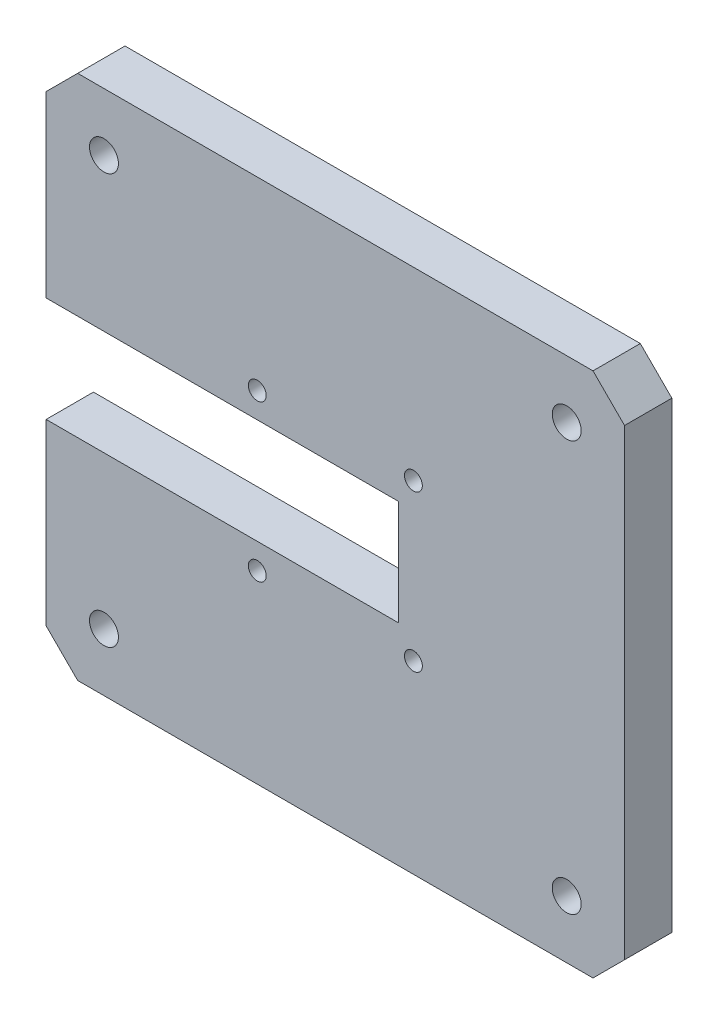
ISO-10303-21;
HEADER;
FILE_DESCRIPTION(('STEP AP214'),'2;1');
FILE_NAME('part.step','',(''),(''),'','','');
FILE_SCHEMA(('AUTOMOTIVE_DESIGN { 1 0 10303 214 1 1 1 1 }'));
ENDSEC;
DATA;
#1=APPLICATION_CONTEXT('core data for automotive mechanical design processes');
#2=APPLICATION_PROTOCOL_DEFINITION('international standard','automotive_design',2000,#1);
#3=PRODUCT_CONTEXT('',#1,'mechanical');
#4=PRODUCT('Part','Part','',(#3));
#5=PRODUCT_RELATED_PRODUCT_CATEGORY('part','',(#4));
#6=PRODUCT_DEFINITION_FORMATION('','',#4);
#7=PRODUCT_DEFINITION_CONTEXT('part definition',#1,'design');
#8=PRODUCT_DEFINITION('design','',#6,#7);
#9=PRODUCT_DEFINITION_SHAPE('','',#8);
#10=(LENGTH_UNIT() NAMED_UNIT(*) SI_UNIT(.MILLI.,.METRE.));
#11=(NAMED_UNIT(*) PLANE_ANGLE_UNIT() SI_UNIT($,.RADIAN.));
#12=(NAMED_UNIT(*) SI_UNIT($,.STERADIAN.) SOLID_ANGLE_UNIT());
#13=UNCERTAINTY_MEASURE_WITH_UNIT(LENGTH_MEASURE(1.E-05),#10,'distance_accuracy_value','');
#14=(GEOMETRIC_REPRESENTATION_CONTEXT(3) GLOBAL_UNCERTAINTY_ASSIGNED_CONTEXT((#13)) GLOBAL_UNIT_ASSIGNED_CONTEXT((#10,
#11,#12)) REPRESENTATION_CONTEXT('',''));
#15=CARTESIAN_POINT('',(0.,0.,0.));
#16=DIRECTION('',(0.,0.,1.));
#17=DIRECTION('',(1.,0.,0.));
#18=AXIS2_PLACEMENT_3D('',#15,#16,#17);
#19=CARTESIAN_POINT('',(0.,0.,0.));
#20=DIRECTION('',(0.,0.,1.));
#21=DIRECTION('',(1.,0.,0.));
#22=AXIS2_PLACEMENT_3D('',#19,#20,#21);
#23=PLANE('',#22);
#24=DIRECTION('',(0.,-1.,0.));
#25=VECTOR('',#24,1.);
#26=CARTESIAN_POINT('',(-55.,-10.,0.));
#27=LINE('',#26,#25);
#28=CARTESIAN_POINT('',(-55.,-10.,0.));
#29=VERTEX_POINT('',#28);
#30=CARTESIAN_POINT('',(-55.,-44.,0.));
#31=VERTEX_POINT('',#30);
#32=EDGE_CURVE('E131',#29,#31,#27,.T.);
#33=ORIENTED_EDGE('',*,*,#32,.F.);
#34=DIRECTION('',(-1.,0.,0.));
#35=VECTOR('',#34,1.);
#36=CARTESIAN_POINT('',(12.,-10.,0.));
#37=LINE('',#36,#35);
#38=CARTESIAN_POINT('',(12.,-10.,0.));
#39=VERTEX_POINT('',#38);
#40=EDGE_CURVE('E52',#39,#29,#37,.T.);
#41=ORIENTED_EDGE('',*,*,#40,.F.);
#42=DIRECTION('',(0.,-1.,0.));
#43=VECTOR('',#42,1.);
#44=CARTESIAN_POINT('',(12.,10.,0.));
#45=LINE('',#44,#43);
#46=CARTESIAN_POINT('',(12.,10.,0.));
#47=VERTEX_POINT('',#46);
#48=EDGE_CURVE('E60',#47,#39,#45,.T.);
#49=ORIENTED_EDGE('',*,*,#48,.F.);
#50=DIRECTION('',(1.,0.,0.));
#51=VECTOR('',#50,1.);
#52=CARTESIAN_POINT('',(-55.,10.,0.));
#53=LINE('',#52,#51);
#54=CARTESIAN_POINT('',(-55.,10.,0.));
#55=VERTEX_POINT('',#54);
#56=EDGE_CURVE('E233',#55,#47,#53,.T.);
#57=ORIENTED_EDGE('',*,*,#56,.F.);
#58=DIRECTION('',(0.,-1.,0.));
#59=VECTOR('',#58,1.);
#60=CARTESIAN_POINT('',(-55.,44.,0.));
#61=LINE('',#60,#59);
#62=CARTESIAN_POINT('',(-55.,44.,0.));
#63=VERTEX_POINT('',#62);
#64=EDGE_CURVE('E231',#63,#55,#61,.T.);
#65=ORIENTED_EDGE('',*,*,#64,.F.);
#66=DIRECTION('',(-0.707106781186547,-0.707106781186548,0.));
#67=VECTOR('',#66,1.);
#68=CARTESIAN_POINT('',(-49.,50.,0.));
#69=LINE('',#68,#67);
#70=CARTESIAN_POINT('',(-49.,50.,0.));
#71=VERTEX_POINT('',#70);
#72=EDGE_CURVE('E229',#71,#63,#69,.T.);
#73=ORIENTED_EDGE('',*,*,#72,.F.);
#74=DIRECTION('',(-1.,0.,0.));
#75=VECTOR('',#74,1.);
#76=CARTESIAN_POINT('',(49.,50.,0.));
#77=LINE('',#76,#75);
#78=CARTESIAN_POINT('',(49.,50.,0.));
#79=VERTEX_POINT('',#78);
#80=EDGE_CURVE('E227',#79,#71,#77,.T.);
#81=ORIENTED_EDGE('',*,*,#80,.F.);
#82=DIRECTION('',(-0.707106781186547,0.707106781186548,0.));
#83=VECTOR('',#82,1.);
#84=CARTESIAN_POINT('',(55.,44.,0.));
#85=LINE('',#84,#83);
#86=CARTESIAN_POINT('',(55.,44.,0.));
#87=VERTEX_POINT('',#86);
#88=EDGE_CURVE('E225',#87,#79,#85,.T.);
#89=ORIENTED_EDGE('',*,*,#88,.F.);
#90=DIRECTION('',(0.,1.,0.));
#91=VECTOR('',#90,1.);
#92=CARTESIAN_POINT('',(55.,-44.,0.));
#93=LINE('',#92,#91);
#94=CARTESIAN_POINT('',(55.,-44.,0.));
#95=VERTEX_POINT('',#94);
#96=EDGE_CURVE('E223',#95,#87,#93,.T.);
#97=ORIENTED_EDGE('',*,*,#96,.F.);
#98=DIRECTION('',(0.707106781186547,0.707106781186548,0.));
#99=VECTOR('',#98,1.);
#100=CARTESIAN_POINT('',(49.,-50.,0.));
#101=LINE('',#100,#99);
#102=CARTESIAN_POINT('',(49.,-50.,0.));
#103=VERTEX_POINT('',#102);
#104=EDGE_CURVE('E221',#103,#95,#101,.T.);
#105=ORIENTED_EDGE('',*,*,#104,.F.);
#106=DIRECTION('',(1.,0.,0.));
#107=VECTOR('',#106,1.);
#108=CARTESIAN_POINT('',(-49.,-50.,0.));
#109=LINE('',#108,#107);
#110=CARTESIAN_POINT('',(-49.,-50.,0.));
#111=VERTEX_POINT('',#110);
#112=EDGE_CURVE('E219',#111,#103,#109,.T.);
#113=ORIENTED_EDGE('',*,*,#112,.F.);
#114=DIRECTION('',(0.707106781186547,-0.707106781186548,0.));
#115=VECTOR('',#114,1.);
#116=CARTESIAN_POINT('',(-55.,-44.,0.));
#117=LINE('',#116,#115);
#118=EDGE_CURVE('E217',#31,#111,#117,.T.);
#119=ORIENTED_EDGE('',*,*,#118,.F.);
#120=EDGE_LOOP('',(#33,#41,#49,#57,#65,#73,#81,#89,#97,#105,#113,#119));
#121=FACE_BOUND('',#120,.T.);
#122=CARTESIAN_POINT('',(-14.845,-14.845,0.));
#123=DIRECTION('',(0.,0.,1.));
#124=DIRECTION('',(1.,0.,0.));
#125=AXIS2_PLACEMENT_3D('',#122,#123,#124);
#126=CIRCLE('',#125,3.75);
#127=CARTESIAN_POINT('',(-11.095,-14.845,0.));
#128=VERTEX_POINT('',#127);
#129=EDGE_CURVE('E211',#128,#128,#126,.T.);
#130=ORIENTED_EDGE('',*,*,#129,.T.);
#131=EDGE_LOOP('',(#130));
#132=FACE_BOUND('',#131,.T.);
#133=CARTESIAN_POINT('',(-14.845,14.845,0.));
#134=DIRECTION('',(0.,0.,1.));
#135=DIRECTION('',(1.,0.,0.));
#136=AXIS2_PLACEMENT_3D('',#133,#134,#135);
#137=CIRCLE('',#136,3.75);
#138=CARTESIAN_POINT('',(-11.095,14.845,0.));
#139=VERTEX_POINT('',#138);
#140=EDGE_CURVE('E206',#139,#139,#137,.T.);
#141=ORIENTED_EDGE('',*,*,#140,.T.);
#142=EDGE_LOOP('',(#141));
#143=FACE_BOUND('',#142,.T.);
#144=CARTESIAN_POINT('',(14.845,-14.845,0.));
#145=DIRECTION('',(0.,0.,1.));
#146=DIRECTION('',(1.,0.,0.));
#147=AXIS2_PLACEMENT_3D('',#144,#145,#146);
#148=CIRCLE('',#147,3.75);
#149=CARTESIAN_POINT('',(18.595,-14.845,0.));
#150=VERTEX_POINT('',#149);
#151=EDGE_CURVE('E200',#150,#150,#148,.T.);
#152=ORIENTED_EDGE('',*,*,#151,.T.);
#153=EDGE_LOOP('',(#152));
#154=FACE_BOUND('',#153,.T.);
#155=CARTESIAN_POINT('',(14.845,14.845,0.));
#156=DIRECTION('',(0.,0.,1.));
#157=DIRECTION('',(1.,0.,0.));
#158=AXIS2_PLACEMENT_3D('',#155,#156,#157);
#159=CIRCLE('',#158,3.75);
#160=CARTESIAN_POINT('',(18.595,14.845,0.));
#161=VERTEX_POINT('',#160);
#162=EDGE_CURVE('E194',#161,#161,#159,.T.);
#163=ORIENTED_EDGE('',*,*,#162,.T.);
#164=EDGE_LOOP('',(#163));
#165=FACE_BOUND('',#164,.T.);
#166=CARTESIAN_POINT('',(-44.,-39.,0.));
#167=DIRECTION('',(0.,0.,1.));
#168=DIRECTION('',(1.,0.,0.));
#169=AXIS2_PLACEMENT_3D('',#166,#167,#168);
#170=CIRCLE('',#169,2.75);
#171=CARTESIAN_POINT('',(-41.25,-39.,0.));
#172=VERTEX_POINT('',#171);
#173=EDGE_CURVE('E191',#172,#172,#170,.T.);
#174=ORIENTED_EDGE('',*,*,#173,.T.);
#175=EDGE_LOOP('',(#174));
#176=FACE_BOUND('',#175,.T.);
#177=CARTESIAN_POINT('',(-44.,39.,0.));
#178=DIRECTION('',(0.,0.,1.));
#179=DIRECTION('',(1.,0.,0.));
#180=AXIS2_PLACEMENT_3D('',#177,#178,#179);
#181=CIRCLE('',#180,2.75);
#182=CARTESIAN_POINT('',(-41.25,39.,0.));
#183=VERTEX_POINT('',#182);
#184=EDGE_CURVE('E188',#183,#183,#181,.T.);
#185=ORIENTED_EDGE('',*,*,#184,.T.);
#186=EDGE_LOOP('',(#185));
#187=FACE_BOUND('',#186,.T.);
#188=CARTESIAN_POINT('',(44.,-39.,0.));
#189=DIRECTION('',(0.,0.,1.));
#190=DIRECTION('',(1.,0.,0.));
#191=AXIS2_PLACEMENT_3D('',#188,#189,#190);
#192=CIRCLE('',#191,2.75);
#193=CARTESIAN_POINT('',(46.75,-39.,0.));
#194=VERTEX_POINT('',#193);
#195=EDGE_CURVE('E184',#194,#194,#192,.T.);
#196=ORIENTED_EDGE('',*,*,#195,.T.);
#197=EDGE_LOOP('',(#196));
#198=FACE_BOUND('',#197,.T.);
#199=CARTESIAN_POINT('',(44.,39.,0.));
#200=DIRECTION('',(0.,0.,1.));
#201=DIRECTION('',(1.,0.,0.));
#202=AXIS2_PLACEMENT_3D('',#199,#200,#201);
#203=CIRCLE('',#202,2.75);
#204=CARTESIAN_POINT('',(46.75,39.,0.));
#205=VERTEX_POINT('',#204);
#206=EDGE_CURVE('E181',#205,#205,#203,.T.);
#207=ORIENTED_EDGE('',*,*,#206,.T.);
#208=EDGE_LOOP('',(#207));
#209=FACE_BOUND('',#208,.T.);
#210=ADVANCED_FACE('F37',(#121,#132,#143,#154,#165,#176,#187,#198,#209),#23,.F.);
#211=CARTESIAN_POINT('',(-55.,-10.,4.));
#212=DIRECTION('',(1.,0.,0.));
#213=DIRECTION('',(0.,0.,-1.));
#214=AXIS2_PLACEMENT_3D('',#211,#212,#213);
#215=PLANE('',#214);
#216=ORIENTED_EDGE('',*,*,#32,.T.);
#217=DIRECTION('',(0.,0.,-1.));
#218=VECTOR('',#217,1.);
#219=CARTESIAN_POINT('',(-55.,-44.,4.));
#220=LINE('',#219,#218);
#221=CARTESIAN_POINT('',(-55.,-44.,9.));
#222=VERTEX_POINT('',#221);
#223=EDGE_CURVE('E11',#222,#31,#220,.T.);
#224=ORIENTED_EDGE('',*,*,#223,.F.);
#225=DIRECTION('',(0.,-1.,0.));
#226=VECTOR('',#225,1.);
#227=CARTESIAN_POINT('',(-55.,-10.,9.));
#228=LINE('',#227,#226);
#229=CARTESIAN_POINT('',(-55.,-10.,9.));
#230=VERTEX_POINT('',#229);
#231=EDGE_CURVE('E129',#230,#222,#228,.T.);
#232=ORIENTED_EDGE('',*,*,#231,.F.);
#233=DIRECTION('',(0.,0.,-1.));
#234=VECTOR('',#233,1.);
#235=CARTESIAN_POINT('',(-55.,-10.,4.));
#236=LINE('',#235,#234);
#237=EDGE_CURVE('E237',#230,#29,#236,.T.);
#238=ORIENTED_EDGE('',*,*,#237,.T.);
#239=EDGE_LOOP('',(#216,#224,#232,#238));
#240=FACE_BOUND('',#239,.T.);
#241=ADVANCED_FACE('F39',(#240),#215,.F.);
#242=CARTESIAN_POINT('',(-55.,-44.,4.));
#243=DIRECTION('',(0.707106781186548,0.707106781186547,0.));
#244=DIRECTION('',(-0.707106781186547,0.707106781186548,0.));
#245=AXIS2_PLACEMENT_3D('',#242,#243,#244);
#246=PLANE('',#245);
#247=ORIENTED_EDGE('',*,*,#118,.T.);
#248=DIRECTION('',(0.,0.,-1.));
#249=VECTOR('',#248,1.);
#250=CARTESIAN_POINT('',(-49.,-50.,4.));
#251=LINE('',#250,#249);
#252=CARTESIAN_POINT('',(-49.,-50.,9.));
#253=VERTEX_POINT('',#252);
#254=EDGE_CURVE('E45',#253,#111,#251,.T.);
#255=ORIENTED_EDGE('',*,*,#254,.F.);
#256=DIRECTION('',(0.707106781186547,-0.707106781186548,0.));
#257=VECTOR('',#256,1.);
#258=CARTESIAN_POINT('',(-55.,-44.,9.));
#259=LINE('',#258,#257);
#260=EDGE_CURVE('E134',#222,#253,#259,.T.);
#261=ORIENTED_EDGE('',*,*,#260,.F.);
#262=ORIENTED_EDGE('',*,*,#223,.T.);
#263=EDGE_LOOP('',(#247,#255,#261,#262));
#264=FACE_BOUND('',#263,.T.);
#265=ADVANCED_FACE('F135',(#264),#246,.F.);
#266=CARTESIAN_POINT('',(-49.,-50.,4.));
#267=DIRECTION('',(0.,1.,0.));
#268=DIRECTION('',(0.,0.,1.));
#269=AXIS2_PLACEMENT_3D('',#266,#267,#268);
#270=PLANE('',#269);
#271=ORIENTED_EDGE('',*,*,#112,.T.);
#272=DIRECTION('',(0.,0.,-1.));
#273=VECTOR('',#272,1.);
#274=CARTESIAN_POINT('',(49.,-50.,4.));
#275=LINE('',#274,#273);
#276=CARTESIAN_POINT('',(49.,-50.,9.));
#277=VERTEX_POINT('',#276);
#278=EDGE_CURVE('E261',#277,#103,#275,.T.);
#279=ORIENTED_EDGE('',*,*,#278,.F.);
#280=DIRECTION('',(1.,0.,0.));
#281=VECTOR('',#280,1.);
#282=CARTESIAN_POINT('',(-49.,-50.,9.));
#283=LINE('',#282,#281);
#284=EDGE_CURVE('E140',#253,#277,#283,.T.);
#285=ORIENTED_EDGE('',*,*,#284,.F.);
#286=ORIENTED_EDGE('',*,*,#254,.T.);
#287=EDGE_LOOP('',(#271,#279,#285,#286));
#288=FACE_BOUND('',#287,.T.);
#289=ADVANCED_FACE('F265',(#288),#270,.F.);
#290=CARTESIAN_POINT('',(49.,-50.,4.));
#291=DIRECTION('',(-0.707106781186548,0.707106781186547,0.));
#292=DIRECTION('',(-0.707106781186547,-0.707106781186548,0.));
#293=AXIS2_PLACEMENT_3D('',#290,#291,#292);
#294=PLANE('',#293);
#295=ORIENTED_EDGE('',*,*,#104,.T.);
#296=DIRECTION('',(0.,0.,-1.));
#297=VECTOR('',#296,1.);
#298=CARTESIAN_POINT('',(55.,-44.,4.));
#299=LINE('',#298,#297);
#300=CARTESIAN_POINT('',(55.,-44.,9.));
#301=VERTEX_POINT('',#300);
#302=EDGE_CURVE('E258',#301,#95,#299,.T.);
#303=ORIENTED_EDGE('',*,*,#302,.F.);
#304=DIRECTION('',(0.707106781186547,0.707106781186548,0.));
#305=VECTOR('',#304,1.);
#306=CARTESIAN_POINT('',(49.,-50.,9.));
#307=LINE('',#306,#305);
#308=EDGE_CURVE('E156',#277,#301,#307,.T.);
#309=ORIENTED_EDGE('',*,*,#308,.F.);
#310=ORIENTED_EDGE('',*,*,#278,.T.);
#311=EDGE_LOOP('',(#295,#303,#309,#310));
#312=FACE_BOUND('',#311,.T.);
#313=ADVANCED_FACE('F272',(#312),#294,.F.);
#314=CARTESIAN_POINT('',(55.,-44.,4.));
#315=DIRECTION('',(-1.,0.,0.));
#316=DIRECTION('',(0.,0.,1.));
#317=AXIS2_PLACEMENT_3D('',#314,#315,#316);
#318=PLANE('',#317);
#319=ORIENTED_EDGE('',*,*,#96,.T.);
#320=DIRECTION('',(0.,0.,-1.));
#321=VECTOR('',#320,1.);
#322=CARTESIAN_POINT('',(55.,44.,4.));
#323=LINE('',#322,#321);
#324=CARTESIAN_POINT('',(55.,44.,9.));
#325=VERTEX_POINT('',#324);
#326=EDGE_CURVE('E255',#325,#87,#323,.T.);
#327=ORIENTED_EDGE('',*,*,#326,.F.);
#328=DIRECTION('',(0.,1.,0.));
#329=VECTOR('',#328,1.);
#330=CARTESIAN_POINT('',(55.,-44.,9.));
#331=LINE('',#330,#329);
#332=EDGE_CURVE('E159',#301,#325,#331,.T.);
#333=ORIENTED_EDGE('',*,*,#332,.F.);
#334=ORIENTED_EDGE('',*,*,#302,.T.);
#335=EDGE_LOOP('',(#319,#327,#333,#334));
#336=FACE_BOUND('',#335,.T.);
#337=ADVANCED_FACE('F276',(#336),#318,.F.);
#338=CARTESIAN_POINT('',(55.,44.,4.));
#339=DIRECTION('',(-0.707106781186548,-0.707106781186547,0.));
#340=DIRECTION('',(0.707106781186547,-0.707106781186548,0.));
#341=AXIS2_PLACEMENT_3D('',#338,#339,#340);
#342=PLANE('',#341);
#343=ORIENTED_EDGE('',*,*,#88,.T.);
#344=DIRECTION('',(0.,0.,-1.));
#345=VECTOR('',#344,1.);
#346=CARTESIAN_POINT('',(49.,50.,4.));
#347=LINE('',#346,#345);
#348=CARTESIAN_POINT('',(49.,50.,9.));
#349=VERTEX_POINT('',#348);
#350=EDGE_CURVE('E252',#349,#79,#347,.T.);
#351=ORIENTED_EDGE('',*,*,#350,.F.);
#352=DIRECTION('',(-0.707106781186547,0.707106781186548,0.));
#353=VECTOR('',#352,1.);
#354=CARTESIAN_POINT('',(55.,44.,9.));
#355=LINE('',#354,#353);
#356=EDGE_CURVE('E162',#325,#349,#355,.T.);
#357=ORIENTED_EDGE('',*,*,#356,.F.);
#358=ORIENTED_EDGE('',*,*,#326,.T.);
#359=EDGE_LOOP('',(#343,#351,#357,#358));
#360=FACE_BOUND('',#359,.T.);
#361=ADVANCED_FACE('F280',(#360),#342,.F.);
#362=CARTESIAN_POINT('',(49.,50.,4.));
#363=DIRECTION('',(0.,-1.,0.));
#364=DIRECTION('',(0.,0.,-1.));
#365=AXIS2_PLACEMENT_3D('',#362,#363,#364);
#366=PLANE('',#365);
#367=ORIENTED_EDGE('',*,*,#80,.T.);
#368=DIRECTION('',(0.,0.,-1.));
#369=VECTOR('',#368,1.);
#370=CARTESIAN_POINT('',(-49.,50.,4.));
#371=LINE('',#370,#369);
#372=CARTESIAN_POINT('',(-49.,50.,9.));
#373=VERTEX_POINT('',#372);
#374=EDGE_CURVE('E249',#373,#71,#371,.T.);
#375=ORIENTED_EDGE('',*,*,#374,.F.);
#376=DIRECTION('',(-1.,0.,0.));
#377=VECTOR('',#376,1.);
#378=CARTESIAN_POINT('',(49.,50.,9.));
#379=LINE('',#378,#377);
#380=EDGE_CURVE('E165',#349,#373,#379,.T.);
#381=ORIENTED_EDGE('',*,*,#380,.F.);
#382=ORIENTED_EDGE('',*,*,#350,.T.);
#383=EDGE_LOOP('',(#367,#375,#381,#382));
#384=FACE_BOUND('',#383,.T.);
#385=ADVANCED_FACE('F283',(#384),#366,.F.);
#386=CARTESIAN_POINT('',(-49.,50.,4.));
#387=DIRECTION('',(0.707106781186548,-0.707106781186547,0.));
#388=DIRECTION('',(0.707106781186547,0.707106781186548,0.));
#389=AXIS2_PLACEMENT_3D('',#386,#387,#388);
#390=PLANE('',#389);
#391=ORIENTED_EDGE('',*,*,#72,.T.);
#392=DIRECTION('',(0.,0.,-1.));
#393=VECTOR('',#392,1.);
#394=CARTESIAN_POINT('',(-55.,44.,4.));
#395=LINE('',#394,#393);
#396=CARTESIAN_POINT('',(-55.,44.,9.));
#397=VERTEX_POINT('',#396);
#398=EDGE_CURVE('E246',#397,#63,#395,.T.);
#399=ORIENTED_EDGE('',*,*,#398,.F.);
#400=DIRECTION('',(-0.707106781186547,-0.707106781186548,0.));
#401=VECTOR('',#400,1.);
#402=CARTESIAN_POINT('',(-49.,50.,9.));
#403=LINE('',#402,#401);
#404=EDGE_CURVE('E168',#373,#397,#403,.T.);
#405=ORIENTED_EDGE('',*,*,#404,.F.);
#406=ORIENTED_EDGE('',*,*,#374,.T.);
#407=EDGE_LOOP('',(#391,#399,#405,#406));
#408=FACE_BOUND('',#407,.T.);
#409=ADVANCED_FACE('F288',(#408),#390,.F.);
#410=CARTESIAN_POINT('',(-55.,44.,4.));
#411=DIRECTION('',(1.,0.,0.));
#412=DIRECTION('',(0.,0.,-1.));
#413=AXIS2_PLACEMENT_3D('',#410,#411,#412);
#414=PLANE('',#413);
#415=ORIENTED_EDGE('',*,*,#64,.T.);
#416=DIRECTION('',(0.,0.,-1.));
#417=VECTOR('',#416,1.);
#418=CARTESIAN_POINT('',(-55.,10.,4.));
#419=LINE('',#418,#417);
#420=CARTESIAN_POINT('',(-55.,10.,9.));
#421=VERTEX_POINT('',#420);
#422=EDGE_CURVE('E243',#421,#55,#419,.T.);
#423=ORIENTED_EDGE('',*,*,#422,.F.);
#424=DIRECTION('',(0.,-1.,0.));
#425=VECTOR('',#424,1.);
#426=CARTESIAN_POINT('',(-55.,44.,9.));
#427=LINE('',#426,#425);
#428=EDGE_CURVE('E171',#397,#421,#427,.T.);
#429=ORIENTED_EDGE('',*,*,#428,.F.);
#430=ORIENTED_EDGE('',*,*,#398,.T.);
#431=EDGE_LOOP('',(#415,#423,#429,#430));
#432=FACE_BOUND('',#431,.T.);
#433=ADVANCED_FACE('F292',(#432),#414,.F.);
#434=CARTESIAN_POINT('',(-55.,10.,4.));
#435=DIRECTION('',(0.,1.,0.));
#436=DIRECTION('',(0.,0.,1.));
#437=AXIS2_PLACEMENT_3D('',#434,#435,#436);
#438=PLANE('',#437);
#439=ORIENTED_EDGE('',*,*,#56,.T.);
#440=DIRECTION('',(0.,0.,-1.));
#441=VECTOR('',#440,1.);
#442=CARTESIAN_POINT('',(12.,10.,4.));
#443=LINE('',#442,#441);
#444=CARTESIAN_POINT('',(12.,10.,9.));
#445=VERTEX_POINT('',#444);
#446=EDGE_CURVE('E241',#445,#47,#443,.T.);
#447=ORIENTED_EDGE('',*,*,#446,.F.);
#448=DIRECTION('',(1.,0.,0.));
#449=VECTOR('',#448,1.);
#450=CARTESIAN_POINT('',(-55.,10.,9.));
#451=LINE('',#450,#449);
#452=EDGE_CURVE('E174',#421,#445,#451,.T.);
#453=ORIENTED_EDGE('',*,*,#452,.F.);
#454=ORIENTED_EDGE('',*,*,#422,.T.);
#455=EDGE_LOOP('',(#439,#447,#453,#454));
#456=FACE_BOUND('',#455,.T.);
#457=ADVANCED_FACE('F296',(#456),#438,.F.);
#458=CARTESIAN_POINT('',(12.,10.,4.));
#459=DIRECTION('',(1.,0.,0.));
#460=DIRECTION('',(0.,0.,-1.));
#461=AXIS2_PLACEMENT_3D('',#458,#459,#460);
#462=PLANE('',#461);
#463=ORIENTED_EDGE('',*,*,#48,.T.);
#464=DIRECTION('',(0.,0.,-1.));
#465=VECTOR('',#464,1.);
#466=CARTESIAN_POINT('',(12.,-10.,4.));
#467=LINE('',#466,#465);
#468=CARTESIAN_POINT('',(12.,-10.,9.));
#469=VERTEX_POINT('',#468);
#470=EDGE_CURVE('E239',#469,#39,#467,.T.);
#471=ORIENTED_EDGE('',*,*,#470,.F.);
#472=DIRECTION('',(0.,-1.,0.));
#473=VECTOR('',#472,1.);
#474=CARTESIAN_POINT('',(12.,10.,9.));
#475=LINE('',#474,#473);
#476=EDGE_CURVE('E177',#445,#469,#475,.T.);
#477=ORIENTED_EDGE('',*,*,#476,.F.);
#478=ORIENTED_EDGE('',*,*,#446,.T.);
#479=EDGE_LOOP('',(#463,#471,#477,#478));
#480=FACE_BOUND('',#479,.T.);
#481=ADVANCED_FACE('F297',(#480),#462,.F.);
#482=CARTESIAN_POINT('',(12.,-10.,4.));
#483=DIRECTION('',(0.,-1.,0.));
#484=DIRECTION('',(0.,0.,-1.));
#485=AXIS2_PLACEMENT_3D('',#482,#483,#484);
#486=PLANE('',#485);
#487=ORIENTED_EDGE('',*,*,#40,.T.);
#488=ORIENTED_EDGE('',*,*,#237,.F.);
#489=DIRECTION('',(-1.,0.,0.));
#490=VECTOR('',#489,1.);
#491=CARTESIAN_POINT('',(12.,-10.,9.));
#492=LINE('',#491,#490);
#493=EDGE_CURVE('E147',#469,#230,#492,.T.);
#494=ORIENTED_EDGE('',*,*,#493,.F.);
#495=ORIENTED_EDGE('',*,*,#470,.T.);
#496=EDGE_LOOP('',(#487,#488,#494,#495));
#497=FACE_BOUND('',#496,.T.);
#498=ADVANCED_FACE('F298',(#497),#486,.F.);
#499=CARTESIAN_POINT('',(-14.845,-14.845,4.));
#500=DIRECTION('',(0.,0.,-1.));
#501=DIRECTION('',(-1.,0.,0.));
#502=AXIS2_PLACEMENT_3D('',#499,#500,#501);
#503=CYLINDRICAL_SURFACE('',#502,3.75);
#504=CARTESIAN_POINT('',(-14.845,-14.845,4.));
#505=DIRECTION('',(0.,0.,1.));
#506=DIRECTION('',(1.,0.,0.));
#507=AXIS2_PLACEMENT_3D('',#504,#505,#506);
#508=CIRCLE('',#507,3.75);
#509=CARTESIAN_POINT('',(-11.095,-14.845,4.));
#510=VERTEX_POINT('',#509);
#511=EDGE_CURVE('E203',#510,#510,#508,.T.);
#512=ORIENTED_EDGE('',*,*,#511,.T.);
#513=EDGE_LOOP('',(#512));
#514=FACE_BOUND('',#513,.T.);
#515=ORIENTED_EDGE('',*,*,#129,.F.);
#516=EDGE_LOOP('',(#515));
#517=FACE_BOUND('',#516,.T.);
#518=ADVANCED_FACE('F300',(#514,#517),#503,.F.);
#519=CARTESIAN_POINT('',(-14.845,14.845,4.));
#520=DIRECTION('',(0.,0.,-1.));
#521=DIRECTION('',(-1.,0.,0.));
#522=AXIS2_PLACEMENT_3D('',#519,#520,#521);
#523=CYLINDRICAL_SURFACE('',#522,3.75);
#524=CARTESIAN_POINT('',(-14.845,14.845,4.));
#525=DIRECTION('',(0.,0.,1.));
#526=DIRECTION('',(1.,0.,0.));
#527=AXIS2_PLACEMENT_3D('',#524,#525,#526);
#528=CIRCLE('',#527,3.75);
#529=CARTESIAN_POINT('',(-11.095,14.845,4.));
#530=VERTEX_POINT('',#529);
#531=EDGE_CURVE('E197',#530,#530,#528,.T.);
#532=ORIENTED_EDGE('',*,*,#531,.T.);
#533=EDGE_LOOP('',(#532));
#534=FACE_BOUND('',#533,.T.);
#535=ORIENTED_EDGE('',*,*,#140,.F.);
#536=EDGE_LOOP('',(#535));
#537=FACE_BOUND('',#536,.T.);
#538=ADVANCED_FACE('F306',(#534,#537),#523,.F.);
#539=CARTESIAN_POINT('',(14.845,-14.845,4.));
#540=DIRECTION('',(0.,0.,-1.));
#541=DIRECTION('',(-1.,0.,0.));
#542=AXIS2_PLACEMENT_3D('',#539,#540,#541);
#543=CYLINDRICAL_SURFACE('',#542,3.75);
#544=CARTESIAN_POINT('',(14.845,-14.845,4.));
#545=DIRECTION('',(0.,0.,1.));
#546=DIRECTION('',(1.,0.,0.));
#547=AXIS2_PLACEMENT_3D('',#544,#545,#546);
#548=CIRCLE('',#547,3.75);
#549=CARTESIAN_POINT('',(18.595,-14.845,4.));
#550=VERTEX_POINT('',#549);
#551=EDGE_CURVE('E185',#550,#550,#548,.T.);
#552=ORIENTED_EDGE('',*,*,#551,.T.);
#553=EDGE_LOOP('',(#552));
#554=FACE_BOUND('',#553,.T.);
#555=ORIENTED_EDGE('',*,*,#151,.F.);
#556=EDGE_LOOP('',(#555));
#557=FACE_BOUND('',#556,.T.);
#558=ADVANCED_FACE('F318',(#554,#557),#543,.F.);
#559=CARTESIAN_POINT('',(14.845,14.845,4.));
#560=DIRECTION('',(0.,0.,-1.));
#561=DIRECTION('',(-1.,0.,0.));
#562=AXIS2_PLACEMENT_3D('',#559,#560,#561);
#563=CYLINDRICAL_SURFACE('',#562,3.75);
#564=CARTESIAN_POINT('',(14.845,14.845,4.));
#565=DIRECTION('',(0.,0.,1.));
#566=DIRECTION('',(1.,0.,0.));
#567=AXIS2_PLACEMENT_3D('',#564,#565,#566);
#568=CIRCLE('',#567,3.75);
#569=CARTESIAN_POINT('',(18.595,14.845,4.));
#570=VERTEX_POINT('',#569);
#571=EDGE_CURVE('E180',#570,#570,#568,.T.);
#572=ORIENTED_EDGE('',*,*,#571,.T.);
#573=EDGE_LOOP('',(#572));
#574=FACE_BOUND('',#573,.T.);
#575=ORIENTED_EDGE('',*,*,#162,.F.);
#576=EDGE_LOOP('',(#575));
#577=FACE_BOUND('',#576,.T.);
#578=ADVANCED_FACE('F322',(#574,#577),#563,.F.);
#579=CARTESIAN_POINT('',(-44.,-39.,4.));
#580=DIRECTION('',(0.,0.,-1.));
#581=DIRECTION('',(-1.,0.,0.));
#582=AXIS2_PLACEMENT_3D('',#579,#580,#581);
#583=CYLINDRICAL_SURFACE('',#582,2.75);
#584=ORIENTED_EDGE('',*,*,#173,.F.);
#585=EDGE_LOOP('',(#584));
#586=FACE_BOUND('',#585,.T.);
#587=CARTESIAN_POINT('',(-44.,-39.,9.));
#588=DIRECTION('',(0.,0.,1.));
#589=DIRECTION('',(1.,0.,0.));
#590=AXIS2_PLACEMENT_3D('',#587,#588,#589);
#591=CIRCLE('',#590,2.75);
#592=CARTESIAN_POINT('',(-41.25,-39.,9.));
#593=VERTEX_POINT('',#592);
#594=EDGE_CURVE('E377',#593,#593,#591,.T.);
#595=ORIENTED_EDGE('',*,*,#594,.T.);
#596=EDGE_LOOP('',(#595));
#597=FACE_BOUND('',#596,.T.);
#598=ADVANCED_FACE('F326',(#586,#597),#583,.F.);
#599=CARTESIAN_POINT('',(-44.,39.,4.));
#600=DIRECTION('',(0.,0.,-1.));
#601=DIRECTION('',(-1.,0.,0.));
#602=AXIS2_PLACEMENT_3D('',#599,#600,#601);
#603=CYLINDRICAL_SURFACE('',#602,2.75);
#604=ORIENTED_EDGE('',*,*,#184,.F.);
#605=EDGE_LOOP('',(#604));
#606=FACE_BOUND('',#605,.T.);
#607=CARTESIAN_POINT('',(-44.,39.,9.));
#608=DIRECTION('',(0.,0.,1.));
#609=DIRECTION('',(1.,0.,0.));
#610=AXIS2_PLACEMENT_3D('',#607,#608,#609);
#611=CIRCLE('',#610,2.75);
#612=CARTESIAN_POINT('',(-41.25,39.,9.));
#613=VERTEX_POINT('',#612);
#614=EDGE_CURVE('E382',#613,#613,#611,.T.);
#615=ORIENTED_EDGE('',*,*,#614,.T.);
#616=EDGE_LOOP('',(#615));
#617=FACE_BOUND('',#616,.T.);
#618=ADVANCED_FACE('F330',(#606,#617),#603,.F.);
#619=CARTESIAN_POINT('',(44.,-39.,4.));
#620=DIRECTION('',(0.,0.,-1.));
#621=DIRECTION('',(-1.,0.,0.));
#622=AXIS2_PLACEMENT_3D('',#619,#620,#621);
#623=CYLINDRICAL_SURFACE('',#622,2.75);
#624=ORIENTED_EDGE('',*,*,#195,.F.);
#625=EDGE_LOOP('',(#624));
#626=FACE_BOUND('',#625,.T.);
#627=CARTESIAN_POINT('',(44.,-39.,9.));
#628=DIRECTION('',(0.,0.,1.));
#629=DIRECTION('',(1.,0.,0.));
#630=AXIS2_PLACEMENT_3D('',#627,#628,#629);
#631=CIRCLE('',#630,2.75);
#632=CARTESIAN_POINT('',(46.75,-39.,9.));
#633=VERTEX_POINT('',#632);
#634=EDGE_CURVE('E422',#633,#633,#631,.T.);
#635=ORIENTED_EDGE('',*,*,#634,.T.);
#636=EDGE_LOOP('',(#635));
#637=FACE_BOUND('',#636,.T.);
#638=ADVANCED_FACE('F334',(#626,#637),#623,.F.);
#639=CARTESIAN_POINT('',(44.,39.,4.));
#640=DIRECTION('',(0.,0.,-1.));
#641=DIRECTION('',(-1.,0.,0.));
#642=AXIS2_PLACEMENT_3D('',#639,#640,#641);
#643=CYLINDRICAL_SURFACE('',#642,2.75);
#644=ORIENTED_EDGE('',*,*,#206,.F.);
#645=EDGE_LOOP('',(#644));
#646=FACE_BOUND('',#645,.T.);
#647=CARTESIAN_POINT('',(44.,39.,9.));
#648=DIRECTION('',(0.,0.,1.));
#649=DIRECTION('',(1.,0.,0.));
#650=AXIS2_PLACEMENT_3D('',#647,#648,#649);
#651=CIRCLE('',#650,2.75);
#652=CARTESIAN_POINT('',(46.75,39.,9.));
#653=VERTEX_POINT('',#652);
#654=EDGE_CURVE('E420',#653,#653,#651,.T.);
#655=ORIENTED_EDGE('',*,*,#654,.T.);
#656=EDGE_LOOP('',(#655));
#657=FACE_BOUND('',#656,.T.);
#658=ADVANCED_FACE('F338',(#646,#657),#643,.F.);
#659=CARTESIAN_POINT('',(0.,0.,4.));
#660=DIRECTION('',(0.,0.,1.));
#661=DIRECTION('',(1.,0.,0.));
#662=AXIS2_PLACEMENT_3D('',#659,#660,#661);
#663=PLANE('',#662);
#664=CARTESIAN_POINT('',(14.845,-14.845,4.));
#665=DIRECTION('',(0.,0.,1.));
#666=DIRECTION('',(1.,0.,0.));
#667=AXIS2_PLACEMENT_3D('',#664,#665,#666);
#668=CIRCLE('',#667,1.7);
#669=CARTESIAN_POINT('',(16.545,-14.845,4.));
#670=VERTEX_POINT('',#669);
#671=EDGE_CURVE('E379',#670,#670,#668,.T.);
#672=ORIENTED_EDGE('',*,*,#671,.T.);
#673=EDGE_LOOP('',(#672));
#674=FACE_BOUND('',#673,.T.);
#675=ORIENTED_EDGE('',*,*,#551,.F.);
#676=EDGE_LOOP('',(#675));
#677=FACE_BOUND('',#676,.T.);
#678=ADVANCED_FACE('F342',(#674,#677),#663,.F.);
#679=CARTESIAN_POINT('',(-14.845,-14.845,4.));
#680=DIRECTION('',(0.,0.,1.));
#681=DIRECTION('',(1.,0.,0.));
#682=AXIS2_PLACEMENT_3D('',#679,#680,#681);
#683=CIRCLE('',#682,1.7);
#684=CARTESIAN_POINT('',(-13.145,-14.845,4.));
#685=VERTEX_POINT('',#684);
#686=EDGE_CURVE('E151',#685,#685,#683,.T.);
#687=ORIENTED_EDGE('',*,*,#686,.T.);
#688=EDGE_LOOP('',(#687));
#689=FACE_BOUND('',#688,.T.);
#690=ORIENTED_EDGE('',*,*,#511,.F.);
#691=EDGE_LOOP('',(#690));
#692=FACE_BOUND('',#691,.T.);
#693=ADVANCED_FACE('F346',(#689,#692),#663,.F.);
#694=CARTESIAN_POINT('',(-14.845,14.845,4.));
#695=DIRECTION('',(0.,0.,1.));
#696=DIRECTION('',(1.,0.,0.));
#697=AXIS2_PLACEMENT_3D('',#694,#695,#696);
#698=CIRCLE('',#697,1.7);
#699=CARTESIAN_POINT('',(-13.145,14.845,4.));
#700=VERTEX_POINT('',#699);
#701=EDGE_CURVE('E388',#700,#700,#698,.T.);
#702=ORIENTED_EDGE('',*,*,#701,.T.);
#703=EDGE_LOOP('',(#702));
#704=FACE_BOUND('',#703,.T.);
#705=ORIENTED_EDGE('',*,*,#531,.F.);
#706=EDGE_LOOP('',(#705));
#707=FACE_BOUND('',#706,.T.);
#708=ADVANCED_FACE('F397',(#704,#707),#663,.F.);
#709=CARTESIAN_POINT('',(14.845,14.845,4.));
#710=DIRECTION('',(0.,0.,1.));
#711=DIRECTION('',(1.,0.,0.));
#712=AXIS2_PLACEMENT_3D('',#709,#710,#711);
#713=CIRCLE('',#712,1.7);
#714=CARTESIAN_POINT('',(16.545,14.845,4.));
#715=VERTEX_POINT('',#714);
#716=EDGE_CURVE('E375',#715,#715,#713,.T.);
#717=ORIENTED_EDGE('',*,*,#716,.T.);
#718=EDGE_LOOP('',(#717));
#719=FACE_BOUND('',#718,.T.);
#720=ORIENTED_EDGE('',*,*,#571,.F.);
#721=EDGE_LOOP('',(#720));
#722=FACE_BOUND('',#721,.T.);
#723=ADVANCED_FACE('F348',(#719,#722),#663,.F.);
#724=CARTESIAN_POINT('',(0.,0.,9.));
#725=DIRECTION('',(0.,0.,1.));
#726=DIRECTION('',(1.,0.,0.));
#727=AXIS2_PLACEMENT_3D('',#724,#725,#726);
#728=PLANE('',#727);
#729=ORIENTED_EDGE('',*,*,#634,.F.);
#730=EDGE_LOOP('',(#729));
#731=FACE_BOUND('',#730,.T.);
#732=ORIENTED_EDGE('',*,*,#594,.F.);
#733=EDGE_LOOP('',(#732));
#734=FACE_BOUND('',#733,.T.);
#735=CARTESIAN_POINT('',(14.845,-14.845,9.));
#736=DIRECTION('',(0.,0.,1.));
#737=DIRECTION('',(1.,0.,0.));
#738=AXIS2_PLACEMENT_3D('',#735,#736,#737);
#739=CIRCLE('',#738,1.7);
#740=CARTESIAN_POINT('',(16.545,-14.845,9.));
#741=VERTEX_POINT('',#740);
#742=EDGE_CURVE('E385',#741,#741,#739,.T.);
#743=ORIENTED_EDGE('',*,*,#742,.F.);
#744=EDGE_LOOP('',(#743));
#745=FACE_BOUND('',#744,.T.);
#746=CARTESIAN_POINT('',(-14.845,-14.845,9.));
#747=DIRECTION('',(0.,0.,1.));
#748=DIRECTION('',(1.,0.,0.));
#749=AXIS2_PLACEMENT_3D('',#746,#747,#748);
#750=CIRCLE('',#749,1.7);
#751=CARTESIAN_POINT('',(-13.145,-14.845,9.));
#752=VERTEX_POINT('',#751);
#753=EDGE_CURVE('E148',#752,#752,#750,.T.);
#754=ORIENTED_EDGE('',*,*,#753,.F.);
#755=EDGE_LOOP('',(#754));
#756=FACE_BOUND('',#755,.T.);
#757=ORIENTED_EDGE('',*,*,#231,.T.);
#758=ORIENTED_EDGE('',*,*,#260,.T.);
#759=ORIENTED_EDGE('',*,*,#284,.T.);
#760=ORIENTED_EDGE('',*,*,#308,.T.);
#761=ORIENTED_EDGE('',*,*,#332,.T.);
#762=ORIENTED_EDGE('',*,*,#356,.T.);
#763=ORIENTED_EDGE('',*,*,#380,.T.);
#764=ORIENTED_EDGE('',*,*,#404,.T.);
#765=ORIENTED_EDGE('',*,*,#428,.T.);
#766=ORIENTED_EDGE('',*,*,#452,.T.);
#767=ORIENTED_EDGE('',*,*,#476,.T.);
#768=ORIENTED_EDGE('',*,*,#493,.T.);
#769=EDGE_LOOP('',(#757,#758,#759,#760,#761,#762,#763,#764,#765,#766,#767,#768));
#770=FACE_BOUND('',#769,.T.);
#771=CARTESIAN_POINT('',(-14.845,14.845,9.));
#772=DIRECTION('',(0.,0.,1.));
#773=DIRECTION('',(1.,0.,0.));
#774=AXIS2_PLACEMENT_3D('',#771,#772,#773);
#775=CIRCLE('',#774,1.7);
#776=CARTESIAN_POINT('',(-13.145,14.845,9.));
#777=VERTEX_POINT('',#776);
#778=EDGE_CURVE('E391',#777,#777,#775,.T.);
#779=ORIENTED_EDGE('',*,*,#778,.F.);
#780=EDGE_LOOP('',(#779));
#781=FACE_BOUND('',#780,.T.);
#782=CARTESIAN_POINT('',(14.845,14.845,9.));
#783=DIRECTION('',(0.,0.,1.));
#784=DIRECTION('',(1.,0.,0.));
#785=AXIS2_PLACEMENT_3D('',#782,#783,#784);
#786=CIRCLE('',#785,1.7);
#787=CARTESIAN_POINT('',(16.545,14.845,9.));
#788=VERTEX_POINT('',#787);
#789=EDGE_CURVE('E372',#788,#788,#786,.T.);
#790=ORIENTED_EDGE('',*,*,#789,.F.);
#791=EDGE_LOOP('',(#790));
#792=FACE_BOUND('',#791,.T.);
#793=ORIENTED_EDGE('',*,*,#614,.F.);
#794=EDGE_LOOP('',(#793));
#795=FACE_BOUND('',#794,.T.);
#796=ORIENTED_EDGE('',*,*,#654,.F.);
#797=EDGE_LOOP('',(#796));
#798=FACE_BOUND('',#797,.T.);
#799=ADVANCED_FACE('F143',(#731,#734,#745,#756,#770,#781,#792,#795,#798),#728,.T.);
#800=CARTESIAN_POINT('',(-14.845,-14.845,9.));
#801=DIRECTION('',(0.,0.,-1.));
#802=DIRECTION('',(-1.,0.,0.));
#803=AXIS2_PLACEMENT_3D('',#800,#801,#802);
#804=CYLINDRICAL_SURFACE('',#803,1.7);
#805=ORIENTED_EDGE('',*,*,#753,.T.);
#806=EDGE_LOOP('',(#805));
#807=FACE_BOUND('',#806,.T.);
#808=ORIENTED_EDGE('',*,*,#686,.F.);
#809=EDGE_LOOP('',(#808));
#810=FACE_BOUND('',#809,.T.);
#811=ADVANCED_FACE('F351',(#807,#810),#804,.F.);
#812=CARTESIAN_POINT('',(-14.845,14.845,9.));
#813=DIRECTION('',(0.,0.,-1.));
#814=DIRECTION('',(-1.,0.,0.));
#815=AXIS2_PLACEMENT_3D('',#812,#813,#814);
#816=CYLINDRICAL_SURFACE('',#815,1.7);
#817=ORIENTED_EDGE('',*,*,#778,.T.);
#818=EDGE_LOOP('',(#817));
#819=FACE_BOUND('',#818,.T.);
#820=ORIENTED_EDGE('',*,*,#701,.F.);
#821=EDGE_LOOP('',(#820));
#822=FACE_BOUND('',#821,.T.);
#823=ADVANCED_FACE('F355',(#819,#822),#816,.F.);
#824=CARTESIAN_POINT('',(14.845,-14.845,9.));
#825=DIRECTION('',(0.,0.,-1.));
#826=DIRECTION('',(-1.,0.,0.));
#827=AXIS2_PLACEMENT_3D('',#824,#825,#826);
#828=CYLINDRICAL_SURFACE('',#827,1.7);
#829=ORIENTED_EDGE('',*,*,#742,.T.);
#830=EDGE_LOOP('',(#829));
#831=FACE_BOUND('',#830,.T.);
#832=ORIENTED_EDGE('',*,*,#671,.F.);
#833=EDGE_LOOP('',(#832));
#834=FACE_BOUND('',#833,.T.);
#835=ADVANCED_FACE('F359',(#831,#834),#828,.F.);
#836=CARTESIAN_POINT('',(14.845,14.845,9.));
#837=DIRECTION('',(0.,0.,-1.));
#838=DIRECTION('',(-1.,0.,0.));
#839=AXIS2_PLACEMENT_3D('',#836,#837,#838);
#840=CYLINDRICAL_SURFACE('',#839,1.7);
#841=ORIENTED_EDGE('',*,*,#789,.T.);
#842=EDGE_LOOP('',(#841));
#843=FACE_BOUND('',#842,.T.);
#844=ORIENTED_EDGE('',*,*,#716,.F.);
#845=EDGE_LOOP('',(#844));
#846=FACE_BOUND('',#845,.T.);
#847=ADVANCED_FACE('F363',(#843,#846),#840,.F.);
#848=CLOSED_SHELL('',(#210,#241,#265,#289,#313,#337,#361,#385,#409,#433,#457,#481,#498,#518,
#538,#558,#578,#598,#618,#638,#658,#678,#693,#708,#723,#799,#811,#823,#835,#847));
#849=MANIFOLD_SOLID_BREP('B2',#848);
#850=ADVANCED_BREP_SHAPE_REPRESENTATION('',(#18,#849),#14);
#851=SHAPE_DEFINITION_REPRESENTATION(#9,#850);
ENDSEC;
END-ISO-10303-21;
